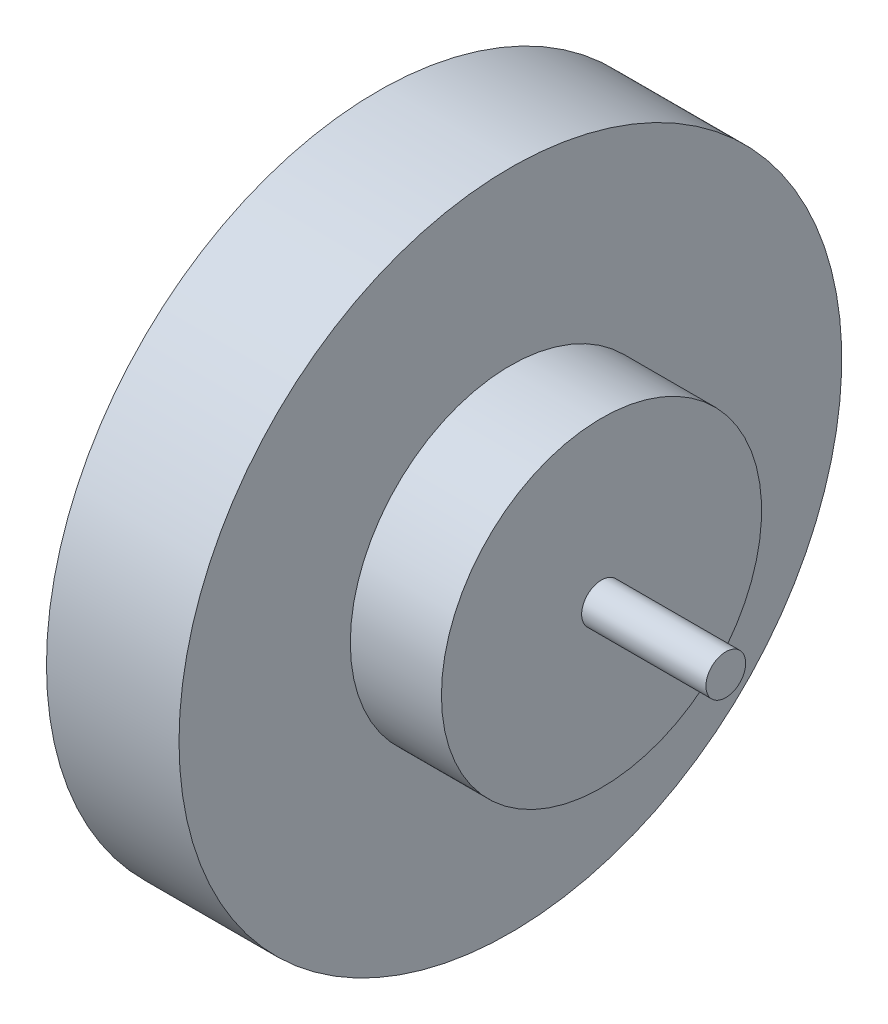
ISO-10303-21;
HEADER;
FILE_DESCRIPTION(('STEP AP214'),'2;1');
FILE_NAME('part.step','',(''),(''),'','','');
FILE_SCHEMA(('AUTOMOTIVE_DESIGN { 1 0 10303 214 1 1 1 1 }'));
ENDSEC;
DATA;
#1=APPLICATION_CONTEXT('core data for automotive mechanical design processes');
#2=APPLICATION_PROTOCOL_DEFINITION('international standard','automotive_design',2000,#1);
#3=PRODUCT_CONTEXT('',#1,'mechanical');
#4=PRODUCT('Part','Part','',(#3));
#5=PRODUCT_RELATED_PRODUCT_CATEGORY('part','',(#4));
#6=PRODUCT_DEFINITION_FORMATION('','',#4);
#7=PRODUCT_DEFINITION_CONTEXT('part definition',#1,'design');
#8=PRODUCT_DEFINITION('design','',#6,#7);
#9=PRODUCT_DEFINITION_SHAPE('','',#8);
#10=(LENGTH_UNIT() NAMED_UNIT(*) SI_UNIT(.MILLI.,.METRE.));
#11=(NAMED_UNIT(*) PLANE_ANGLE_UNIT() SI_UNIT($,.RADIAN.));
#12=(NAMED_UNIT(*) SI_UNIT($,.STERADIAN.) SOLID_ANGLE_UNIT());
#13=UNCERTAINTY_MEASURE_WITH_UNIT(LENGTH_MEASURE(1.E-05),#10,'distance_accuracy_value','');
#14=(GEOMETRIC_REPRESENTATION_CONTEXT(3) GLOBAL_UNCERTAINTY_ASSIGNED_CONTEXT((#13)) GLOBAL_UNIT_ASSIGNED_CONTEXT((#10,
#11,#12)) REPRESENTATION_CONTEXT('',''));
#15=CARTESIAN_POINT('',(0.,0.,0.));
#16=DIRECTION('',(0.,0.,1.));
#17=DIRECTION('',(1.,0.,0.));
#18=AXIS2_PLACEMENT_3D('',#15,#16,#17);
#19=CARTESIAN_POINT('',(-1219.94371054837,0.,0.));
#20=DIRECTION('',(-1.,0.,0.));
#21=DIRECTION('',(0.,0.,1.));
#22=AXIS2_PLACEMENT_3D('',#19,#20,#21);
#23=CYLINDRICAL_SURFACE('',#22,100.);
#24=CARTESIAN_POINT('',(20.,0.,0.));
#25=DIRECTION('',(-1.,0.,0.));
#26=DIRECTION('',(0.,0.,1.));
#27=AXIS2_PLACEMENT_3D('',#24,#25,#26);
#28=CIRCLE('',#27,100.);
#29=CARTESIAN_POINT('',(20.,0.,100.));
#30=VERTEX_POINT('',#29);
#31=EDGE_CURVE('E10',#30,#30,#28,.T.);
#32=ORIENTED_EDGE('',*,*,#31,.T.);
#33=EDGE_LOOP('',(#32));
#34=FACE_BOUND('',#33,.T.);
#35=CARTESIAN_POINT('',(-20.,0.,0.));
#36=DIRECTION('',(-1.,0.,0.));
#37=DIRECTION('',(0.,0.,1.));
#38=AXIS2_PLACEMENT_3D('',#35,#36,#37);
#39=CIRCLE('',#38,100.);
#40=CARTESIAN_POINT('',(-20.,0.,100.));
#41=VERTEX_POINT('',#40);
#42=EDGE_CURVE('E64',#41,#41,#39,.T.);
#43=ORIENTED_EDGE('',*,*,#42,.F.);
#44=EDGE_LOOP('',(#43));
#45=FACE_BOUND('',#44,.T.);
#46=ADVANCED_FACE('F37',(#34,#45),#23,.T.);
#47=CARTESIAN_POINT('',(20.,100.,0.));
#48=DIRECTION('',(-1.,0.,0.));
#49=DIRECTION('',(0.,0.,1.));
#50=AXIS2_PLACEMENT_3D('',#47,#48,#49);
#51=PLANE('',#50);
#52=ORIENTED_EDGE('',*,*,#31,.F.);
#53=EDGE_LOOP('',(#52));
#54=FACE_BOUND('',#53,.T.);
#55=CARTESIAN_POINT('',(20.,0.,0.));
#56=DIRECTION('',(-1.,0.,0.));
#57=DIRECTION('',(0.,0.,1.));
#58=AXIS2_PLACEMENT_3D('',#55,#56,#57);
#59=CIRCLE('',#58,48.308684326347);
#60=CARTESIAN_POINT('',(20.,0.,48.308684326347));
#61=VERTEX_POINT('',#60);
#62=EDGE_CURVE('E44',#61,#61,#59,.T.);
#63=ORIENTED_EDGE('',*,*,#62,.T.);
#64=EDGE_LOOP('',(#63));
#65=FACE_BOUND('',#64,.T.);
#66=ADVANCED_FACE('F101',(#54,#65),#51,.F.);
#67=CARTESIAN_POINT('',(-1219.94371054837,0.,0.));
#68=DIRECTION('',(-1.,0.,0.));
#69=DIRECTION('',(0.,0.,1.));
#70=AXIS2_PLACEMENT_3D('',#67,#68,#69);
#71=CYLINDRICAL_SURFACE('',#70,48.308684326347);
#72=ORIENTED_EDGE('',*,*,#62,.F.);
#73=EDGE_LOOP('',(#72));
#74=FACE_BOUND('',#73,.T.);
#75=CARTESIAN_POINT('',(47.4999999999999,0.,0.));
#76=DIRECTION('',(-1.,0.,0.));
#77=DIRECTION('',(0.,0.,1.));
#78=AXIS2_PLACEMENT_3D('',#75,#76,#77);
#79=CIRCLE('',#78,48.308684326347);
#80=CARTESIAN_POINT('',(47.4999999999999,0.,48.308684326347));
#81=VERTEX_POINT('',#80);
#82=EDGE_CURVE('E49',#81,#81,#79,.T.);
#83=ORIENTED_EDGE('',*,*,#82,.T.);
#84=EDGE_LOOP('',(#83));
#85=FACE_BOUND('',#84,.T.);
#86=ADVANCED_FACE('F105',(#74,#85),#71,.T.);
#87=CARTESIAN_POINT('',(47.5,48.308684326347,0.));
#88=DIRECTION('',(-1.,0.,0.));
#89=DIRECTION('',(0.,0.,1.));
#90=AXIS2_PLACEMENT_3D('',#87,#88,#89);
#91=PLANE('',#90);
#92=ORIENTED_EDGE('',*,*,#82,.F.);
#93=EDGE_LOOP('',(#92));
#94=FACE_BOUND('',#93,.T.);
#95=CARTESIAN_POINT('',(47.5000000000001,0.,0.));
#96=DIRECTION('',(-1.,0.,0.));
#97=DIRECTION('',(0.,0.,1.));
#98=AXIS2_PLACEMENT_3D('',#95,#96,#97);
#99=CIRCLE('',#98,6.);
#100=CARTESIAN_POINT('',(47.5000000000001,0.,6.));
#101=VERTEX_POINT('',#100);
#102=EDGE_CURVE('E54',#101,#101,#99,.T.);
#103=ORIENTED_EDGE('',*,*,#102,.T.);
#104=EDGE_LOOP('',(#103));
#105=FACE_BOUND('',#104,.T.);
#106=ADVANCED_FACE('F132',(#94,#105),#91,.F.);
#107=CARTESIAN_POINT('',(-1219.94371054837,0.,0.));
#108=DIRECTION('',(-1.,0.,0.));
#109=DIRECTION('',(0.,0.,1.));
#110=AXIS2_PLACEMENT_3D('',#107,#108,#109);
#111=CYLINDRICAL_SURFACE('',#110,6.);
#112=ORIENTED_EDGE('',*,*,#102,.F.);
#113=EDGE_LOOP('',(#112));
#114=FACE_BOUND('',#113,.T.);
#115=CARTESIAN_POINT('',(85.,0.,0.));
#116=DIRECTION('',(-1.,0.,0.));
#117=DIRECTION('',(0.,0.,1.));
#118=AXIS2_PLACEMENT_3D('',#115,#116,#117);
#119=CIRCLE('',#118,6.);
#120=CARTESIAN_POINT('',(85.,0.,6.));
#121=VERTEX_POINT('',#120);
#122=EDGE_CURVE('E60',#121,#121,#119,.T.);
#123=ORIENTED_EDGE('',*,*,#122,.T.);
#124=EDGE_LOOP('',(#123));
#125=FACE_BOUND('',#124,.T.);
#126=ADVANCED_FACE('F128',(#114,#125),#111,.T.);
#127=CARTESIAN_POINT('',(85.,6.,0.));
#128=DIRECTION('',(-1.,0.,0.));
#129=DIRECTION('',(0.,0.,1.));
#130=AXIS2_PLACEMENT_3D('',#127,#128,#129);
#131=PLANE('',#130);
#132=ORIENTED_EDGE('',*,*,#122,.F.);
#133=EDGE_LOOP('',(#132));
#134=FACE_BOUND('',#133,.T.);
#135=ADVANCED_FACE('F113',(#134),#131,.F.);
#136=CARTESIAN_POINT('',(-20.,100.,0.));
#137=DIRECTION('',(1.,0.,0.));
#138=DIRECTION('',(0.,0.,1.));
#139=AXIS2_PLACEMENT_3D('',#136,#137,#138);
#140=PLANE('',#139);
#141=ORIENTED_EDGE('',*,*,#42,.T.);
#142=EDGE_LOOP('',(#141));
#143=FACE_BOUND('',#142,.T.);
#144=CARTESIAN_POINT('',(-20.,0.,0.));
#145=DIRECTION('',(-1.,0.,0.));
#146=DIRECTION('',(0.,0.,1.));
#147=AXIS2_PLACEMENT_3D('',#144,#145,#146);
#148=CIRCLE('',#147,48.308684326347);
#149=CARTESIAN_POINT('',(-20.,0.,48.308684326347));
#150=VERTEX_POINT('',#149);
#151=EDGE_CURVE('E68',#150,#150,#148,.T.);
#152=ORIENTED_EDGE('',*,*,#151,.F.);
#153=EDGE_LOOP('',(#152));
#154=FACE_BOUND('',#153,.T.);
#155=ADVANCED_FACE('F110',(#143,#154),#140,.F.);
#156=CARTESIAN_POINT('',(1219.94371054837,0.,0.));
#157=DIRECTION('',(1.,0.,0.));
#158=DIRECTION('',(0.,0.,1.));
#159=AXIS2_PLACEMENT_3D('',#156,#157,#158);
#160=CYLINDRICAL_SURFACE('',#159,48.308684326347);
#161=ORIENTED_EDGE('',*,*,#151,.T.);
#162=EDGE_LOOP('',(#161));
#163=FACE_BOUND('',#162,.T.);
#164=CARTESIAN_POINT('',(-47.4999999999999,0.,0.));
#165=DIRECTION('',(-1.,0.,0.));
#166=DIRECTION('',(0.,0.,1.));
#167=AXIS2_PLACEMENT_3D('',#164,#165,#166);
#168=CIRCLE('',#167,48.308684326347);
#169=CARTESIAN_POINT('',(-47.4999999999999,0.,48.308684326347));
#170=VERTEX_POINT('',#169);
#171=EDGE_CURVE('E72',#170,#170,#168,.T.);
#172=ORIENTED_EDGE('',*,*,#171,.F.);
#173=EDGE_LOOP('',(#172));
#174=FACE_BOUND('',#173,.T.);
#175=ADVANCED_FACE('F97',(#163,#174),#160,.T.);
#176=CARTESIAN_POINT('',(-47.5,48.308684326347,0.));
#177=DIRECTION('',(1.,0.,0.));
#178=DIRECTION('',(0.,0.,1.));
#179=AXIS2_PLACEMENT_3D('',#176,#177,#178);
#180=PLANE('',#179);
#181=ORIENTED_EDGE('',*,*,#171,.T.);
#182=EDGE_LOOP('',(#181));
#183=FACE_BOUND('',#182,.T.);
#184=CARTESIAN_POINT('',(-47.5000000000001,0.,0.));
#185=DIRECTION('',(-1.,0.,0.));
#186=DIRECTION('',(0.,0.,1.));
#187=AXIS2_PLACEMENT_3D('',#184,#185,#186);
#188=CIRCLE('',#187,6.);
#189=CARTESIAN_POINT('',(-47.5000000000001,0.,6.));
#190=VERTEX_POINT('',#189);
#191=EDGE_CURVE('E76',#190,#190,#188,.T.);
#192=ORIENTED_EDGE('',*,*,#191,.F.);
#193=EDGE_LOOP('',(#192));
#194=FACE_BOUND('',#193,.T.);
#195=ADVANCED_FACE('F89',(#183,#194),#180,.F.);
#196=CARTESIAN_POINT('',(1219.94371054837,0.,0.));
#197=DIRECTION('',(1.,0.,0.));
#198=DIRECTION('',(0.,0.,1.));
#199=AXIS2_PLACEMENT_3D('',#196,#197,#198);
#200=CYLINDRICAL_SURFACE('',#199,6.);
#201=ORIENTED_EDGE('',*,*,#191,.T.);
#202=EDGE_LOOP('',(#201));
#203=FACE_BOUND('',#202,.T.);
#204=CARTESIAN_POINT('',(-85.,0.,0.));
#205=DIRECTION('',(-1.,0.,0.));
#206=DIRECTION('',(0.,0.,1.));
#207=AXIS2_PLACEMENT_3D('',#204,#205,#206);
#208=CIRCLE('',#207,6.);
#209=CARTESIAN_POINT('',(-85.,0.,6.));
#210=VERTEX_POINT('',#209);
#211=EDGE_CURVE('E80',#210,#210,#208,.T.);
#212=ORIENTED_EDGE('',*,*,#211,.F.);
#213=EDGE_LOOP('',(#212));
#214=FACE_BOUND('',#213,.T.);
#215=ADVANCED_FACE('F87',(#203,#214),#200,.T.);
#216=CARTESIAN_POINT('',(-85.,6.,0.));
#217=DIRECTION('',(1.,0.,0.));
#218=DIRECTION('',(0.,0.,1.));
#219=AXIS2_PLACEMENT_3D('',#216,#217,#218);
#220=PLANE('',#219);
#221=ORIENTED_EDGE('',*,*,#211,.T.);
#222=EDGE_LOOP('',(#221));
#223=FACE_BOUND('',#222,.T.);
#224=ADVANCED_FACE('F85',(#223),#220,.F.);
#225=CLOSED_SHELL('',(#46,#66,#86,#106,#126,#135,#155,#175,#195,#215,#224));
#226=MANIFOLD_SOLID_BREP('B2',#225);
#227=ADVANCED_BREP_SHAPE_REPRESENTATION('',(#18,#226),#14);
#228=SHAPE_DEFINITION_REPRESENTATION(#9,#227);
ENDSEC;
END-ISO-10303-21;
